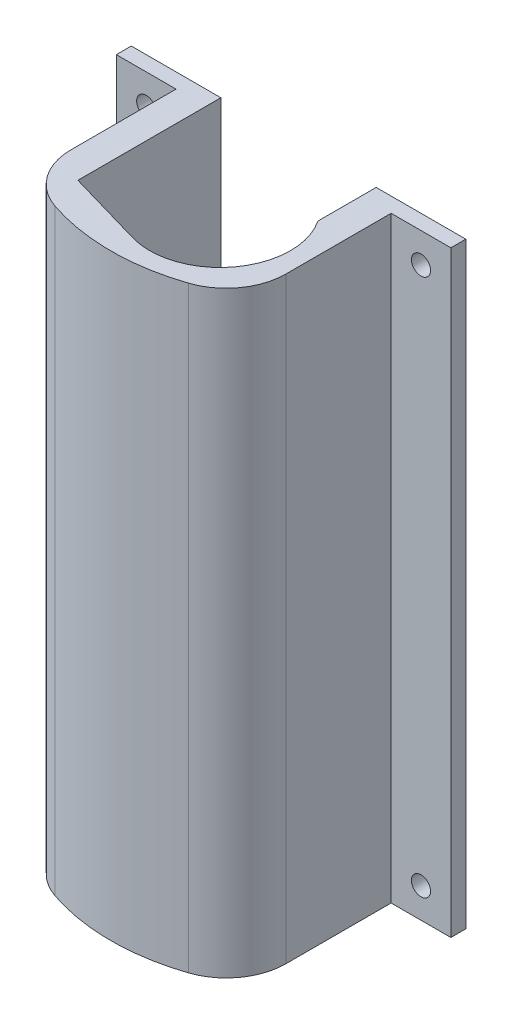
ISO-10303-21;
HEADER;
FILE_DESCRIPTION(('STEP AP214'),'2;1');
FILE_NAME('part.step','',(''),(''),'','','');
FILE_SCHEMA(('AUTOMOTIVE_DESIGN { 1 0 10303 214 1 1 1 1 }'));
ENDSEC;
DATA;
#1=APPLICATION_CONTEXT('core data for automotive mechanical design processes');
#2=APPLICATION_PROTOCOL_DEFINITION('international standard','automotive_design',2000,#1);
#3=PRODUCT_CONTEXT('',#1,'mechanical');
#4=PRODUCT('Part','Part','',(#3));
#5=PRODUCT_RELATED_PRODUCT_CATEGORY('part','',(#4));
#6=PRODUCT_DEFINITION_FORMATION('','',#4);
#7=PRODUCT_DEFINITION_CONTEXT('part definition',#1,'design');
#8=PRODUCT_DEFINITION('design','',#6,#7);
#9=PRODUCT_DEFINITION_SHAPE('','',#8);
#10=(LENGTH_UNIT() NAMED_UNIT(*) SI_UNIT(.MILLI.,.METRE.));
#11=(NAMED_UNIT(*) PLANE_ANGLE_UNIT() SI_UNIT($,.RADIAN.));
#12=(NAMED_UNIT(*) SI_UNIT($,.STERADIAN.) SOLID_ANGLE_UNIT());
#13=UNCERTAINTY_MEASURE_WITH_UNIT(LENGTH_MEASURE(1.E-05),#10,'distance_accuracy_value','');
#14=(GEOMETRIC_REPRESENTATION_CONTEXT(3) GLOBAL_UNCERTAINTY_ASSIGNED_CONTEXT((#13)) GLOBAL_UNIT_ASSIGNED_CONTEXT((#10,
#11,#12)) REPRESENTATION_CONTEXT('',''));
#15=CARTESIAN_POINT('',(0.,0.,0.));
#16=DIRECTION('',(0.,0.,1.));
#17=DIRECTION('',(1.,0.,0.));
#18=AXIS2_PLACEMENT_3D('',#15,#16,#17);
#19=CARTESIAN_POINT('',(-20.574,127.,-9.65199999999999));
#20=DIRECTION('',(-1.,0.,0.));
#21=DIRECTION('',(0.,0.,1.));
#22=AXIS2_PLACEMENT_3D('',#19,#20,#21);
#23=PLANE('',#22);
#24=DIRECTION('',(0.,0.,-1.));
#25=VECTOR('',#24,1.);
#26=CARTESIAN_POINT('',(-20.574,0.,-9.65199999999999));
#27=LINE('',#26,#25);
#28=CARTESIAN_POINT('',(-20.574,0.,9.65212960437079));
#29=VERTEX_POINT('',#28);
#30=CARTESIAN_POINT('',(-20.574,0.,-20.7467128871305));
#31=VERTEX_POINT('',#30);
#32=EDGE_CURVE('E168',#29,#31,#27,.T.);
#33=ORIENTED_EDGE('',*,*,#32,.T.);
#34=DIRECTION('',(0.,-1.,0.));
#35=VECTOR('',#34,1.);
#36=CARTESIAN_POINT('',(-20.574,127.,-20.7467128871305));
#37=LINE('',#36,#35);
#38=CARTESIAN_POINT('',(-20.574,127.,-20.7467128871305));
#39=VERTEX_POINT('',#38);
#40=EDGE_CURVE('E167',#39,#31,#37,.T.);
#41=ORIENTED_EDGE('',*,*,#40,.F.);
#42=DIRECTION('',(0.,0.,-1.));
#43=VECTOR('',#42,1.);
#44=CARTESIAN_POINT('',(-20.574,127.,-9.65199999999999));
#45=LINE('',#44,#43);
#46=CARTESIAN_POINT('',(-20.574,127.,9.65212960437079));
#47=VERTEX_POINT('',#46);
#48=EDGE_CURVE('E152',#47,#39,#45,.T.);
#49=ORIENTED_EDGE('',*,*,#48,.F.);
#50=DIRECTION('',(0.,-1.,0.));
#51=VECTOR('',#50,1.);
#52=CARTESIAN_POINT('',(-20.574,127.,9.65212960437079));
#53=LINE('',#52,#51);
#54=EDGE_CURVE('E214',#47,#29,#53,.T.);
#55=ORIENTED_EDGE('',*,*,#54,.T.);
#56=EDGE_LOOP('',(#33,#41,#49,#55));
#57=FACE_BOUND('',#56,.T.);
#58=ADVANCED_FACE('F43',(#57),#23,.F.);
#59=CARTESIAN_POINT('',(-39.624,127.,-20.7467128871305));
#60=DIRECTION('',(0.,0.,1.));
#61=DIRECTION('',(1.,0.,0.));
#62=AXIS2_PLACEMENT_3D('',#59,#60,#61);
#63=PLANE('',#62);
#64=CARTESIAN_POINT('',(-33.274,6.35,-20.7467128871305));
#65=DIRECTION('',(0.,0.,1.));
#66=DIRECTION('',(1.,0.,0.));
#67=AXIS2_PLACEMENT_3D('',#64,#65,#66);
#68=CIRCLE('',#67,2.032);
#69=CARTESIAN_POINT('',(-31.242,6.35,-20.7467128871305));
#70=VERTEX_POINT('',#69);
#71=EDGE_CURVE('E586',#70,#70,#68,.T.);
#72=ORIENTED_EDGE('',*,*,#71,.T.);
#73=EDGE_LOOP('',(#72));
#74=FACE_BOUND('',#73,.T.);
#75=CARTESIAN_POINT('',(-33.274,120.65,-20.7467128871305));
#76=DIRECTION('',(0.,0.,1.));
#77=DIRECTION('',(1.,0.,0.));
#78=AXIS2_PLACEMENT_3D('',#75,#76,#77);
#79=CIRCLE('',#78,2.03200000000002);
#80=CARTESIAN_POINT('',(-31.242,120.65,-20.7467128871305));
#81=VERTEX_POINT('',#80);
#82=EDGE_CURVE('E218',#81,#81,#79,.T.);
#83=ORIENTED_EDGE('',*,*,#82,.T.);
#84=EDGE_LOOP('',(#83));
#85=FACE_BOUND('',#84,.T.);
#86=DIRECTION('',(-1.,0.,0.));
#87=VECTOR('',#86,1.);
#88=CARTESIAN_POINT('',(-39.624,0.,-20.7467128871305));
#89=LINE('',#88,#87);
#90=CARTESIAN_POINT('',(-39.624,0.,-20.7467128871305));
#91=VERTEX_POINT('',#90);
#92=EDGE_CURVE('E217',#31,#91,#89,.T.);
#93=ORIENTED_EDGE('',*,*,#92,.T.);
#94=DIRECTION('',(0.,-1.,0.));
#95=VECTOR('',#94,1.);
#96=CARTESIAN_POINT('',(-39.624,127.,-20.7467128871305));
#97=LINE('',#96,#95);
#98=CARTESIAN_POINT('',(-39.624,127.,-20.7467128871305));
#99=VERTEX_POINT('',#98);
#100=EDGE_CURVE('E173',#99,#91,#97,.T.);
#101=ORIENTED_EDGE('',*,*,#100,.F.);
#102=DIRECTION('',(-1.,0.,0.));
#103=VECTOR('',#102,1.);
#104=CARTESIAN_POINT('',(-39.624,127.,-20.7467128871305));
#105=LINE('',#104,#103);
#106=EDGE_CURVE('E156',#39,#99,#105,.T.);
#107=ORIENTED_EDGE('',*,*,#106,.F.);
#108=ORIENTED_EDGE('',*,*,#40,.T.);
#109=EDGE_LOOP('',(#93,#101,#107,#108));
#110=FACE_BOUND('',#109,.T.);
#111=ADVANCED_FACE('F175',(#74,#85,#110),#63,.F.);
#112=CARTESIAN_POINT('',(-39.624,127.,-20.7467128871305));
#113=DIRECTION('',(1.,0.,0.));
#114=DIRECTION('',(0.,0.,-1.));
#115=AXIS2_PLACEMENT_3D('',#112,#113,#114);
#116=PLANE('',#115);
#117=DIRECTION('',(0.,0.,1.));
#118=VECTOR('',#117,1.);
#119=CARTESIAN_POINT('',(-39.624,0.,-20.7467128871305));
#120=LINE('',#119,#118);
#121=CARTESIAN_POINT('',(-39.624,0.,-17.5717128871305));
#122=VERTEX_POINT('',#121);
#123=EDGE_CURVE('E221',#91,#122,#120,.T.);
#124=ORIENTED_EDGE('',*,*,#123,.T.);
#125=DIRECTION('',(0.,-1.,0.));
#126=VECTOR('',#125,1.);
#127=CARTESIAN_POINT('',(-39.624,127.,-17.5717128871305));
#128=LINE('',#127,#126);
#129=CARTESIAN_POINT('',(-39.624,127.,-17.5717128871305));
#130=VERTEX_POINT('',#129);
#131=EDGE_CURVE('E284',#130,#122,#128,.T.);
#132=ORIENTED_EDGE('',*,*,#131,.F.);
#133=DIRECTION('',(0.,0.,1.));
#134=VECTOR('',#133,1.);
#135=CARTESIAN_POINT('',(-39.624,127.,-20.7467128871305));
#136=LINE('',#135,#134);
#137=EDGE_CURVE('E179',#99,#130,#136,.T.);
#138=ORIENTED_EDGE('',*,*,#137,.F.);
#139=ORIENTED_EDGE('',*,*,#100,.T.);
#140=EDGE_LOOP('',(#124,#132,#138,#139));
#141=FACE_BOUND('',#140,.T.);
#142=ADVANCED_FACE('F336',(#141),#116,.F.);
#143=CARTESIAN_POINT('',(-39.624,127.,-17.5717128871305));
#144=DIRECTION('',(0.,0.,-1.));
#145=DIRECTION('',(-1.,0.,0.));
#146=AXIS2_PLACEMENT_3D('',#143,#144,#145);
#147=PLANE('',#146);
#148=CARTESIAN_POINT('',(-33.274,6.35,-17.5717128871305));
#149=DIRECTION('',(0.,0.,1.));
#150=DIRECTION('',(1.,0.,0.));
#151=AXIS2_PLACEMENT_3D('',#148,#149,#150);
#152=CIRCLE('',#151,2.032);
#153=CARTESIAN_POINT('',(-31.242,6.35,-17.5717128871305));
#154=VERTEX_POINT('',#153);
#155=EDGE_CURVE('E591',#154,#154,#152,.T.);
#156=ORIENTED_EDGE('',*,*,#155,.F.);
#157=EDGE_LOOP('',(#156));
#158=FACE_BOUND('',#157,.T.);
#159=CARTESIAN_POINT('',(-33.274,120.65,-17.5717128871305));
#160=DIRECTION('',(0.,0.,1.));
#161=DIRECTION('',(1.,0.,0.));
#162=AXIS2_PLACEMENT_3D('',#159,#160,#161);
#163=CIRCLE('',#162,2.03200000000002);
#164=CARTESIAN_POINT('',(-31.242,120.65,-17.5717128871305));
#165=VERTEX_POINT('',#164);
#166=EDGE_CURVE('E590',#165,#165,#163,.T.);
#167=ORIENTED_EDGE('',*,*,#166,.F.);
#168=EDGE_LOOP('',(#167));
#169=FACE_BOUND('',#168,.T.);
#170=DIRECTION('',(1.,0.,0.));
#171=VECTOR('',#170,1.);
#172=CARTESIAN_POINT('',(-39.624,0.,-17.5717128871305));
#173=LINE('',#172,#171);
#174=CARTESIAN_POINT('',(-26.924,0.,-17.5717128871305));
#175=VERTEX_POINT('',#174);
#176=EDGE_CURVE('E224',#122,#175,#173,.T.);
#177=ORIENTED_EDGE('',*,*,#176,.T.);
#178=DIRECTION('',(0.,-1.,0.));
#179=VECTOR('',#178,1.);
#180=CARTESIAN_POINT('',(-26.924,127.,-17.5717128871305));
#181=LINE('',#180,#179);
#182=CARTESIAN_POINT('',(-26.924,127.,-17.5717128871305));
#183=VERTEX_POINT('',#182);
#184=EDGE_CURVE('E280',#183,#175,#181,.T.);
#185=ORIENTED_EDGE('',*,*,#184,.F.);
#186=DIRECTION('',(1.,0.,0.));
#187=VECTOR('',#186,1.);
#188=CARTESIAN_POINT('',(-39.624,127.,-17.5717128871305));
#189=LINE('',#188,#187);
#190=EDGE_CURVE('E182',#130,#183,#189,.T.);
#191=ORIENTED_EDGE('',*,*,#190,.F.);
#192=ORIENTED_EDGE('',*,*,#131,.T.);
#193=EDGE_LOOP('',(#177,#185,#191,#192));
#194=FACE_BOUND('',#193,.T.);
#195=ADVANCED_FACE('F332',(#158,#169,#194),#147,.F.);
#196=CARTESIAN_POINT('',(-26.924,127.,-17.5717128871305));
#197=DIRECTION('',(1.,0.,0.));
#198=DIRECTION('',(0.,0.,-1.));
#199=AXIS2_PLACEMENT_3D('',#196,#197,#198);
#200=PLANE('',#199);
#201=DIRECTION('',(0.,0.,1.));
#202=VECTOR('',#201,1.);
#203=CARTESIAN_POINT('',(-26.924,0.,-17.5717128871305));
#204=LINE('',#203,#202);
#205=CARTESIAN_POINT('',(-26.924,0.,4.78647579118017));
#206=VERTEX_POINT('',#205);
#207=EDGE_CURVE('E227',#175,#206,#204,.T.);
#208=ORIENTED_EDGE('',*,*,#207,.T.);
#209=DIRECTION('',(0.,-1.,0.));
#210=VECTOR('',#209,1.);
#211=CARTESIAN_POINT('',(-26.924,127.,4.78647579118017));
#212=LINE('',#211,#210);
#213=CARTESIAN_POINT('',(-26.924,127.,4.78647579118017));
#214=VERTEX_POINT('',#213);
#215=EDGE_CURVE('E11',#206,#214,#212,.F.);
#216=ORIENTED_EDGE('',*,*,#215,.T.);
#217=DIRECTION('',(0.,0.,1.));
#218=VECTOR('',#217,1.);
#219=CARTESIAN_POINT('',(-26.924,127.,-17.5717128871305));
#220=LINE('',#219,#218);
#221=EDGE_CURVE('E188',#183,#214,#220,.T.);
#222=ORIENTED_EDGE('',*,*,#221,.F.);
#223=ORIENTED_EDGE('',*,*,#184,.T.);
#224=EDGE_LOOP('',(#208,#216,#222,#223));
#225=FACE_BOUND('',#224,.T.);
#226=ADVANCED_FACE('F328',(#225),#200,.F.);
#227=CARTESIAN_POINT('',(-4.06400000000001,127.,-25.2940311859304));
#228=DIRECTION('',(0.,-1.,0.));
#229=DIRECTION('',(0.,0.,-1.));
#230=AXIS2_PLACEMENT_3D('',#227,#228,#229);
#231=CYLINDRICAL_SURFACE('',#230,44.45);
#232=CARTESIAN_POINT('',(-4.06400000000001,0.,-25.2940311859304));
#233=DIRECTION('',(0.,1.,0.));
#234=DIRECTION('',(0.,0.,1.));
#235=AXIS2_PLACEMENT_3D('',#232,#233,#234);
#236=CIRCLE('',#235,44.45);
#237=CARTESIAN_POINT('',(-18.288,0.,16.8186785820244));
#238=VERTEX_POINT('',#237);
#239=CARTESIAN_POINT('',(10.16,0.,16.8186785820244));
#240=VERTEX_POINT('',#239);
#241=EDGE_CURVE('E230',#238,#240,#236,.T.);
#242=ORIENTED_EDGE('',*,*,#241,.T.);
#243=DIRECTION('',(0.,-1.,0.));
#244=VECTOR('',#243,1.);
#245=CARTESIAN_POINT('',(10.16,127.,16.8186785820244));
#246=LINE('',#245,#244);
#247=CARTESIAN_POINT('',(10.16,127.,16.8186785820244));
#248=VERTEX_POINT('',#247);
#249=EDGE_CURVE('E65',#240,#248,#246,.F.);
#250=ORIENTED_EDGE('',*,*,#249,.T.);
#251=CARTESIAN_POINT('',(-4.06400000000001,127.,-25.2940311859304));
#252=DIRECTION('',(0.,1.,0.));
#253=DIRECTION('',(0.,0.,1.));
#254=AXIS2_PLACEMENT_3D('',#251,#252,#253);
#255=CIRCLE('',#254,44.45);
#256=CARTESIAN_POINT('',(-18.288,127.,16.8186785820244));
#257=VERTEX_POINT('',#256);
#258=EDGE_CURVE('E191',#257,#248,#255,.T.);
#259=ORIENTED_EDGE('',*,*,#258,.F.);
#260=DIRECTION('',(0.,-1.,0.));
#261=VECTOR('',#260,1.);
#262=CARTESIAN_POINT('',(-18.288,127.,16.8186785820244));
#263=LINE('',#262,#261);
#264=EDGE_CURVE('E299',#257,#238,#263,.T.);
#265=ORIENTED_EDGE('',*,*,#264,.T.);
#266=EDGE_LOOP('',(#242,#250,#259,#265));
#267=FACE_BOUND('',#266,.T.);
#268=ADVANCED_FACE('F322',(#267),#231,.T.);
#269=CARTESIAN_POINT('',(18.796,127.,-17.5717128871305));
#270=DIRECTION('',(-1.,0.,0.));
#271=DIRECTION('',(0.,0.,1.));
#272=AXIS2_PLACEMENT_3D('',#269,#270,#271);
#273=PLANE('',#272);
#274=DIRECTION('',(0.,0.,-1.));
#275=VECTOR('',#274,1.);
#276=CARTESIAN_POINT('',(18.796,127.,-17.5717128871305));
#277=LINE('',#276,#275);
#278=CARTESIAN_POINT('',(18.796,127.,4.78647579118017));
#279=VERTEX_POINT('',#278);
#280=CARTESIAN_POINT('',(18.796,127.,-17.5717128871305));
#281=VERTEX_POINT('',#280);
#282=EDGE_CURVE('E194',#279,#281,#277,.T.);
#283=ORIENTED_EDGE('',*,*,#282,.F.);
#284=DIRECTION('',(0.,-1.,0.));
#285=VECTOR('',#284,1.);
#286=CARTESIAN_POINT('',(18.796,127.,4.78647579118017));
#287=LINE('',#286,#285);
#288=CARTESIAN_POINT('',(18.796,0.,4.78647579118017));
#289=VERTEX_POINT('',#288);
#290=EDGE_CURVE('E172',#279,#289,#287,.T.);
#291=ORIENTED_EDGE('',*,*,#290,.T.);
#292=DIRECTION('',(0.,0.,-1.));
#293=VECTOR('',#292,1.);
#294=CARTESIAN_POINT('',(18.796,0.,-17.5717128871305));
#295=LINE('',#294,#293);
#296=CARTESIAN_POINT('',(18.796,0.,-17.5717128871305));
#297=VERTEX_POINT('',#296);
#298=EDGE_CURVE('E233',#289,#297,#295,.T.);
#299=ORIENTED_EDGE('',*,*,#298,.T.);
#300=DIRECTION('',(0.,-1.,0.));
#301=VECTOR('',#300,1.);
#302=CARTESIAN_POINT('',(18.796,127.,-17.5717128871305));
#303=LINE('',#302,#301);
#304=EDGE_CURVE('E276',#281,#297,#303,.T.);
#305=ORIENTED_EDGE('',*,*,#304,.F.);
#306=EDGE_LOOP('',(#283,#291,#299,#305));
#307=FACE_BOUND('',#306,.T.);
#308=ADVANCED_FACE('F314',(#307),#273,.F.);
#309=CARTESIAN_POINT('',(31.496,127.,-17.5717128871305));
#310=DIRECTION('',(0.,0.,-1.));
#311=DIRECTION('',(-1.,0.,0.));
#312=AXIS2_PLACEMENT_3D('',#309,#310,#311);
#313=PLANE('',#312);
#314=CARTESIAN_POINT('',(25.146,120.65,-17.5717128871305));
#315=DIRECTION('',(0.,0.,1.));
#316=DIRECTION('',(1.,0.,0.));
#317=AXIS2_PLACEMENT_3D('',#314,#315,#316);
#318=CIRCLE('',#317,2.03200000000002);
#319=CARTESIAN_POINT('',(27.178,120.65,-17.5717128871305));
#320=VERTEX_POINT('',#319);
#321=EDGE_CURVE('E583',#320,#320,#318,.T.);
#322=ORIENTED_EDGE('',*,*,#321,.F.);
#323=EDGE_LOOP('',(#322));
#324=FACE_BOUND('',#323,.T.);
#325=CARTESIAN_POINT('',(25.146,6.35000000000002,-17.5717128871305));
#326=DIRECTION('',(0.,0.,1.));
#327=DIRECTION('',(1.,0.,0.));
#328=AXIS2_PLACEMENT_3D('',#325,#326,#327);
#329=CIRCLE('',#328,2.032);
#330=CARTESIAN_POINT('',(27.178,6.35000000000002,-17.5717128871305));
#331=VERTEX_POINT('',#330);
#332=EDGE_CURVE('E578',#331,#331,#329,.T.);
#333=ORIENTED_EDGE('',*,*,#332,.F.);
#334=EDGE_LOOP('',(#333));
#335=FACE_BOUND('',#334,.T.);
#336=DIRECTION('',(1.,0.,0.));
#337=VECTOR('',#336,1.);
#338=CARTESIAN_POINT('',(31.496,0.,-17.5717128871305));
#339=LINE('',#338,#337);
#340=CARTESIAN_POINT('',(31.496,0.,-17.5717128871305));
#341=VERTEX_POINT('',#340);
#342=EDGE_CURVE('E236',#297,#341,#339,.T.);
#343=ORIENTED_EDGE('',*,*,#342,.T.);
#344=DIRECTION('',(0.,-1.,0.));
#345=VECTOR('',#344,1.);
#346=CARTESIAN_POINT('',(31.496,127.,-17.5717128871305));
#347=LINE('',#346,#345);
#348=CARTESIAN_POINT('',(31.496,127.,-17.5717128871305));
#349=VERTEX_POINT('',#348);
#350=EDGE_CURVE('E272',#349,#341,#347,.T.);
#351=ORIENTED_EDGE('',*,*,#350,.F.);
#352=DIRECTION('',(1.,0.,0.));
#353=VECTOR('',#352,1.);
#354=CARTESIAN_POINT('',(31.496,127.,-17.5717128871305));
#355=LINE('',#354,#353);
#356=EDGE_CURVE('E197',#281,#349,#355,.T.);
#357=ORIENTED_EDGE('',*,*,#356,.F.);
#358=ORIENTED_EDGE('',*,*,#304,.T.);
#359=EDGE_LOOP('',(#343,#351,#357,#358));
#360=FACE_BOUND('',#359,.T.);
#361=ADVANCED_FACE('F397',(#324,#335,#360),#313,.F.);
#362=CARTESIAN_POINT('',(31.496,127.,-20.7467128871305));
#363=DIRECTION('',(-1.,0.,0.));
#364=DIRECTION('',(0.,0.,1.));
#365=AXIS2_PLACEMENT_3D('',#362,#363,#364);
#366=PLANE('',#365);
#367=DIRECTION('',(0.,0.,-1.));
#368=VECTOR('',#367,1.);
#369=CARTESIAN_POINT('',(31.496,0.,-20.7467128871305));
#370=LINE('',#369,#368);
#371=CARTESIAN_POINT('',(31.496,0.,-20.7467128871305));
#372=VERTEX_POINT('',#371);
#373=EDGE_CURVE('E239',#341,#372,#370,.T.);
#374=ORIENTED_EDGE('',*,*,#373,.T.);
#375=DIRECTION('',(0.,-1.,0.));
#376=VECTOR('',#375,1.);
#377=CARTESIAN_POINT('',(31.496,127.,-20.7467128871305));
#378=LINE('',#377,#376);
#379=CARTESIAN_POINT('',(31.496,127.,-20.7467128871305));
#380=VERTEX_POINT('',#379);
#381=EDGE_CURVE('E268',#380,#372,#378,.T.);
#382=ORIENTED_EDGE('',*,*,#381,.F.);
#383=DIRECTION('',(0.,0.,-1.));
#384=VECTOR('',#383,1.);
#385=CARTESIAN_POINT('',(31.496,127.,-20.7467128871305));
#386=LINE('',#385,#384);
#387=EDGE_CURVE('E200',#349,#380,#386,.T.);
#388=ORIENTED_EDGE('',*,*,#387,.F.);
#389=ORIENTED_EDGE('',*,*,#350,.T.);
#390=EDGE_LOOP('',(#374,#382,#388,#389));
#391=FACE_BOUND('',#390,.T.);
#392=ADVANCED_FACE('F393',(#391),#366,.F.);
#393=CARTESIAN_POINT('',(12.446,127.,-20.7467128871305));
#394=DIRECTION('',(0.,0.,1.));
#395=DIRECTION('',(1.,0.,0.));
#396=AXIS2_PLACEMENT_3D('',#393,#394,#395);
#397=PLANE('',#396);
#398=CARTESIAN_POINT('',(25.146,120.65,-20.7467128871305));
#399=DIRECTION('',(0.,0.,1.));
#400=DIRECTION('',(1.,0.,0.));
#401=AXIS2_PLACEMENT_3D('',#398,#399,#400);
#402=CIRCLE('',#401,2.03200000000002);
#403=CARTESIAN_POINT('',(27.178,120.65,-20.7467128871305));
#404=VERTEX_POINT('',#403);
#405=EDGE_CURVE('E595',#404,#404,#402,.T.);
#406=ORIENTED_EDGE('',*,*,#405,.T.);
#407=EDGE_LOOP('',(#406));
#408=FACE_BOUND('',#407,.T.);
#409=CARTESIAN_POINT('',(25.146,6.35000000000002,-20.7467128871305));
#410=DIRECTION('',(0.,0.,1.));
#411=DIRECTION('',(1.,0.,0.));
#412=AXIS2_PLACEMENT_3D('',#409,#410,#411);
#413=CIRCLE('',#412,2.032);
#414=CARTESIAN_POINT('',(27.178,6.35000000000002,-20.7467128871305));
#415=VERTEX_POINT('',#414);
#416=EDGE_CURVE('E575',#415,#415,#413,.T.);
#417=ORIENTED_EDGE('',*,*,#416,.T.);
#418=EDGE_LOOP('',(#417));
#419=FACE_BOUND('',#418,.T.);
#420=DIRECTION('',(-1.,0.,0.));
#421=VECTOR('',#420,1.);
#422=CARTESIAN_POINT('',(12.446,0.,-20.7467128871305));
#423=LINE('',#422,#421);
#424=CARTESIAN_POINT('',(12.446,0.,-20.7467128871305));
#425=VERTEX_POINT('',#424);
#426=EDGE_CURVE('E242',#372,#425,#423,.T.);
#427=ORIENTED_EDGE('',*,*,#426,.T.);
#428=DIRECTION('',(0.,-1.,0.));
#429=VECTOR('',#428,1.);
#430=CARTESIAN_POINT('',(12.446,127.,-20.7467128871305));
#431=LINE('',#430,#429);
#432=CARTESIAN_POINT('',(12.446,127.,-20.7467128871305));
#433=VERTEX_POINT('',#432);
#434=EDGE_CURVE('E264',#433,#425,#431,.T.);
#435=ORIENTED_EDGE('',*,*,#434,.F.);
#436=DIRECTION('',(-1.,0.,0.));
#437=VECTOR('',#436,1.);
#438=CARTESIAN_POINT('',(12.446,127.,-20.7467128871305));
#439=LINE('',#438,#437);
#440=EDGE_CURVE('E203',#380,#433,#439,.T.);
#441=ORIENTED_EDGE('',*,*,#440,.F.);
#442=ORIENTED_EDGE('',*,*,#381,.T.);
#443=EDGE_LOOP('',(#427,#435,#441,#442));
#444=FACE_BOUND('',#443,.T.);
#445=ADVANCED_FACE('F389',(#408,#419,#444),#397,.F.);
#446=CARTESIAN_POINT('',(12.446,127.,-20.7467128871305));
#447=DIRECTION('',(1.,0.,0.));
#448=DIRECTION('',(0.,0.,-1.));
#449=AXIS2_PLACEMENT_3D('',#446,#447,#448);
#450=PLANE('',#449);
#451=DIRECTION('',(0.,0.,1.));
#452=VECTOR('',#451,1.);
#453=CARTESIAN_POINT('',(12.446,0.,-20.7467128871305));
#454=LINE('',#453,#452);
#455=CARTESIAN_POINT('',(12.446,0.,-8.34779649654001));
#456=VERTEX_POINT('',#455);
#457=EDGE_CURVE('E245',#425,#456,#454,.T.);
#458=ORIENTED_EDGE('',*,*,#457,.T.);
#459=DIRECTION('',(0.,-1.,0.));
#460=VECTOR('',#459,1.);
#461=CARTESIAN_POINT('',(12.446,127.,-8.34779649654001));
#462=LINE('',#461,#460);
#463=CARTESIAN_POINT('',(12.446,127.,-8.34779649654001));
#464=VERTEX_POINT('',#463);
#465=EDGE_CURVE('E260',#464,#456,#462,.T.);
#466=ORIENTED_EDGE('',*,*,#465,.F.);
#467=DIRECTION('',(0.,0.,1.));
#468=VECTOR('',#467,1.);
#469=CARTESIAN_POINT('',(12.446,127.,-20.7467128871305));
#470=LINE('',#469,#468);
#471=EDGE_CURVE('E206',#433,#464,#470,.T.);
#472=ORIENTED_EDGE('',*,*,#471,.F.);
#473=ORIENTED_EDGE('',*,*,#434,.T.);
#474=EDGE_LOOP('',(#458,#466,#472,#473));
#475=FACE_BOUND('',#474,.T.);
#476=ADVANCED_FACE('F385',(#475),#450,.F.);
#477=CARTESIAN_POINT('',(0.,127.,0.));
#478=DIRECTION('',(0.,-1.,0.));
#479=DIRECTION('',(0.,0.,-1.));
#480=AXIS2_PLACEMENT_3D('',#477,#478,#479);
#481=CYLINDRICAL_SURFACE('',#480,14.9862811380157);
#482=CARTESIAN_POINT('',(0.,0.,0.));
#483=DIRECTION('',(0.,-1.,0.));
#484=DIRECTION('',(0.,0.,1.));
#485=AXIS2_PLACEMENT_3D('',#482,#483,#484);
#486=CIRCLE('',#485,14.9862811380157);
#487=CARTESIAN_POINT('',(-4.16201958345776,0.,14.3967432197202));
#488=VERTEX_POINT('',#487);
#489=EDGE_CURVE('E248',#456,#488,#486,.T.);
#490=ORIENTED_EDGE('',*,*,#489,.T.);
#491=DIRECTION('',(0.,-1.,0.));
#492=VECTOR('',#491,1.);
#493=CARTESIAN_POINT('',(-4.16201958345776,127.,14.3967432197202));
#494=LINE('',#493,#492);
#495=CARTESIAN_POINT('',(-4.16201958345776,127.,14.3967432197202));
#496=VERTEX_POINT('',#495);
#497=EDGE_CURVE('E256',#496,#488,#494,.T.);
#498=ORIENTED_EDGE('',*,*,#497,.F.);
#499=CARTESIAN_POINT('',(0.,127.,0.));
#500=DIRECTION('',(0.,-1.,0.));
#501=DIRECTION('',(0.,0.,1.));
#502=AXIS2_PLACEMENT_3D('',#499,#500,#501);
#503=CIRCLE('',#502,14.9862811380157);
#504=EDGE_CURVE('E209',#464,#496,#503,.T.);
#505=ORIENTED_EDGE('',*,*,#504,.F.);
#506=ORIENTED_EDGE('',*,*,#465,.T.);
#507=EDGE_LOOP('',(#490,#498,#505,#506));
#508=FACE_BOUND('',#507,.T.);
#509=ADVANCED_FACE('F381',(#508),#481,.F.);
#510=CARTESIAN_POINT('',(-20.574,127.,9.65212960437079));
#511=DIRECTION('',(-0.27772197419278,0.,0.960661493477523));
#512=DIRECTION('',(0.960661493477523,0.,0.27772197419278));
#513=AXIS2_PLACEMENT_3D('',#510,#511,#512);
#514=PLANE('',#513);
#515=DIRECTION('',(-0.960661493477523,0.,-0.27772197419278));
#516=VECTOR('',#515,1.);
#517=CARTESIAN_POINT('',(-20.574,0.,9.65212960437079));
#518=LINE('',#517,#516);
#519=EDGE_CURVE('E164',#488,#29,#518,.T.);
#520=ORIENTED_EDGE('',*,*,#519,.T.);
#521=ORIENTED_EDGE('',*,*,#54,.F.);
#522=DIRECTION('',(-0.960661493477523,0.,-0.27772197419278));
#523=VECTOR('',#522,1.);
#524=CARTESIAN_POINT('',(-20.574,127.,9.65212960437079));
#525=LINE('',#524,#523);
#526=EDGE_CURVE('E159',#496,#47,#525,.T.);
#527=ORIENTED_EDGE('',*,*,#526,.F.);
#528=ORIENTED_EDGE('',*,*,#497,.T.);
#529=EDGE_LOOP('',(#520,#521,#527,#528));
#530=FACE_BOUND('',#529,.T.);
#531=ADVANCED_FACE('F376',(#530),#514,.F.);
#532=CARTESIAN_POINT('',(0.,127.,0.));
#533=DIRECTION('',(0.,1.,0.));
#534=DIRECTION('',(0.,0.,1.));
#535=AXIS2_PLACEMENT_3D('',#532,#533,#534);
#536=PLANE('',#535);
#537=ORIENTED_EDGE('',*,*,#258,.T.);
#538=CARTESIAN_POINT('',(6.09599999999999,127.,4.78647579118017));
#539=DIRECTION('',(0.,1.,0.));
#540=DIRECTION('',(0.,0.,1.));
#541=AXIS2_PLACEMENT_3D('',#538,#539,#540);
#542=CIRCLE('',#541,12.7);
#543=EDGE_CURVE('E52',#248,#279,#542,.T.);
#544=ORIENTED_EDGE('',*,*,#543,.T.);
#545=ORIENTED_EDGE('',*,*,#282,.T.);
#546=ORIENTED_EDGE('',*,*,#356,.T.);
#547=ORIENTED_EDGE('',*,*,#387,.T.);
#548=ORIENTED_EDGE('',*,*,#440,.T.);
#549=ORIENTED_EDGE('',*,*,#471,.T.);
#550=ORIENTED_EDGE('',*,*,#504,.T.);
#551=ORIENTED_EDGE('',*,*,#526,.T.);
#552=ORIENTED_EDGE('',*,*,#48,.T.);
#553=ORIENTED_EDGE('',*,*,#106,.T.);
#554=ORIENTED_EDGE('',*,*,#137,.T.);
#555=ORIENTED_EDGE('',*,*,#190,.T.);
#556=ORIENTED_EDGE('',*,*,#221,.T.);
#557=CARTESIAN_POINT('',(-14.224,127.,4.78647579118017));
#558=DIRECTION('',(0.,1.,0.));
#559=DIRECTION('',(0.,0.,1.));
#560=AXIS2_PLACEMENT_3D('',#557,#558,#559);
#561=CIRCLE('',#560,12.7);
#562=EDGE_CURVE('E305',#214,#257,#561,.T.);
#563=ORIENTED_EDGE('',*,*,#562,.T.);
#564=EDGE_LOOP('',(#537,#544,#545,#546,#547,#548,#549,#550,#551,#552,#553,#554,#555,#556,#563));
#565=FACE_BOUND('',#564,.T.);
#566=ADVANCED_FACE('F154',(#565),#536,.T.);
#567=CARTESIAN_POINT('',(0.,0.,0.));
#568=DIRECTION('',(0.,1.,0.));
#569=DIRECTION('',(0.,0.,1.));
#570=AXIS2_PLACEMENT_3D('',#567,#568,#569);
#571=PLANE('',#570);
#572=ORIENTED_EDGE('',*,*,#298,.F.);
#573=CARTESIAN_POINT('',(6.09599999999999,0.,4.78647579118017));
#574=DIRECTION('',(0.,1.,0.));
#575=DIRECTION('',(0.,0.,1.));
#576=AXIS2_PLACEMENT_3D('',#573,#574,#575);
#577=CIRCLE('',#576,12.7);
#578=EDGE_CURVE('E296',#289,#240,#577,.F.);
#579=ORIENTED_EDGE('',*,*,#578,.T.);
#580=ORIENTED_EDGE('',*,*,#241,.F.);
#581=CARTESIAN_POINT('',(-14.224,0.,4.78647579118017));
#582=DIRECTION('',(0.,1.,0.));
#583=DIRECTION('',(0.,0.,1.));
#584=AXIS2_PLACEMENT_3D('',#581,#582,#583);
#585=CIRCLE('',#584,12.7);
#586=EDGE_CURVE('E293',#238,#206,#585,.F.);
#587=ORIENTED_EDGE('',*,*,#586,.T.);
#588=ORIENTED_EDGE('',*,*,#207,.F.);
#589=ORIENTED_EDGE('',*,*,#176,.F.);
#590=ORIENTED_EDGE('',*,*,#123,.F.);
#591=ORIENTED_EDGE('',*,*,#92,.F.);
#592=ORIENTED_EDGE('',*,*,#32,.F.);
#593=ORIENTED_EDGE('',*,*,#519,.F.);
#594=ORIENTED_EDGE('',*,*,#489,.F.);
#595=ORIENTED_EDGE('',*,*,#457,.F.);
#596=ORIENTED_EDGE('',*,*,#426,.F.);
#597=ORIENTED_EDGE('',*,*,#373,.F.);
#598=ORIENTED_EDGE('',*,*,#342,.F.);
#599=EDGE_LOOP('',(#572,#579,#580,#587,#588,#589,#590,#591,#592,#593,#594,#595,#596,#597,#598));
#600=FACE_BOUND('',#599,.T.);
#601=ADVANCED_FACE('F320',(#600),#571,.F.);
#602=CARTESIAN_POINT('',(25.146,6.35000000000002,-20.7467128871305));
#603=DIRECTION('',(0.,0.,1.));
#604=DIRECTION('',(1.,0.,0.));
#605=AXIS2_PLACEMENT_3D('',#602,#603,#604);
#606=CYLINDRICAL_SURFACE('',#605,2.032);
#607=ORIENTED_EDGE('',*,*,#416,.F.);
#608=EDGE_LOOP('',(#607));
#609=FACE_BOUND('',#608,.T.);
#610=ORIENTED_EDGE('',*,*,#332,.T.);
#611=EDGE_LOOP('',(#610));
#612=FACE_BOUND('',#611,.T.);
#613=ADVANCED_FACE('F370',(#609,#612),#606,.F.);
#614=CARTESIAN_POINT('',(25.146,120.65,-20.7467128871305));
#615=DIRECTION('',(0.,0.,1.));
#616=DIRECTION('',(1.,0.,0.));
#617=AXIS2_PLACEMENT_3D('',#614,#615,#616);
#618=CYLINDRICAL_SURFACE('',#617,2.03200000000002);
#619=ORIENTED_EDGE('',*,*,#405,.F.);
#620=EDGE_LOOP('',(#619));
#621=FACE_BOUND('',#620,.T.);
#622=ORIENTED_EDGE('',*,*,#321,.T.);
#623=EDGE_LOOP('',(#622));
#624=FACE_BOUND('',#623,.T.);
#625=ADVANCED_FACE('F363',(#621,#624),#618,.F.);
#626=CARTESIAN_POINT('',(-33.274,120.65,-20.7467128871305));
#627=DIRECTION('',(0.,0.,1.));
#628=DIRECTION('',(1.,0.,0.));
#629=AXIS2_PLACEMENT_3D('',#626,#627,#628);
#630=CYLINDRICAL_SURFACE('',#629,2.03200000000002);
#631=ORIENTED_EDGE('',*,*,#82,.F.);
#632=EDGE_LOOP('',(#631));
#633=FACE_BOUND('',#632,.T.);
#634=ORIENTED_EDGE('',*,*,#166,.T.);
#635=EDGE_LOOP('',(#634));
#636=FACE_BOUND('',#635,.T.);
#637=ADVANCED_FACE('F357',(#633,#636),#630,.F.);
#638=CARTESIAN_POINT('',(-33.274,6.35,-20.7467128871305));
#639=DIRECTION('',(0.,0.,1.));
#640=DIRECTION('',(1.,0.,0.));
#641=AXIS2_PLACEMENT_3D('',#638,#639,#640);
#642=CYLINDRICAL_SURFACE('',#641,2.032);
#643=ORIENTED_EDGE('',*,*,#71,.F.);
#644=EDGE_LOOP('',(#643));
#645=FACE_BOUND('',#644,.T.);
#646=ORIENTED_EDGE('',*,*,#155,.T.);
#647=EDGE_LOOP('',(#646));
#648=FACE_BOUND('',#647,.T.);
#649=ADVANCED_FACE('F352',(#645,#648),#642,.F.);
#650=CARTESIAN_POINT('',(6.09599999999999,127.,4.78647579118017));
#651=DIRECTION('',(0.,-1.,0.));
#652=DIRECTION('',(0.,0.,-1.));
#653=AXIS2_PLACEMENT_3D('',#650,#651,#652);
#654=CYLINDRICAL_SURFACE('',#653,12.7);
#655=ORIENTED_EDGE('',*,*,#543,.F.);
#656=ORIENTED_EDGE('',*,*,#249,.F.);
#657=ORIENTED_EDGE('',*,*,#578,.F.);
#658=ORIENTED_EDGE('',*,*,#290,.F.);
#659=EDGE_LOOP('',(#655,#656,#657,#658));
#660=FACE_BOUND('',#659,.T.);
#661=ADVANCED_FACE('F317',(#660),#654,.T.);
#662=CARTESIAN_POINT('',(-14.224,127.,4.78647579118017));
#663=DIRECTION('',(0.,-1.,0.));
#664=DIRECTION('',(0.,0.,-1.));
#665=AXIS2_PLACEMENT_3D('',#662,#663,#664);
#666=CYLINDRICAL_SURFACE('',#665,12.7);
#667=ORIENTED_EDGE('',*,*,#562,.F.);
#668=ORIENTED_EDGE('',*,*,#215,.F.);
#669=ORIENTED_EDGE('',*,*,#586,.F.);
#670=ORIENTED_EDGE('',*,*,#264,.F.);
#671=EDGE_LOOP('',(#667,#668,#669,#670));
#672=FACE_BOUND('',#671,.T.);
#673=ADVANCED_FACE('F45',(#672),#666,.T.);
#674=CLOSED_SHELL('',(#58,#111,#142,#195,#226,#268,#308,#361,#392,#445,#476,#509,#531,#566,#601,
#613,#625,#637,#649,#661,#673));
#675=MANIFOLD_SOLID_BREP('B2',#674);
#676=ADVANCED_BREP_SHAPE_REPRESENTATION('',(#18,#675),#14);
#677=SHAPE_DEFINITION_REPRESENTATION(#9,#676);
ENDSEC;
END-ISO-10303-21;
